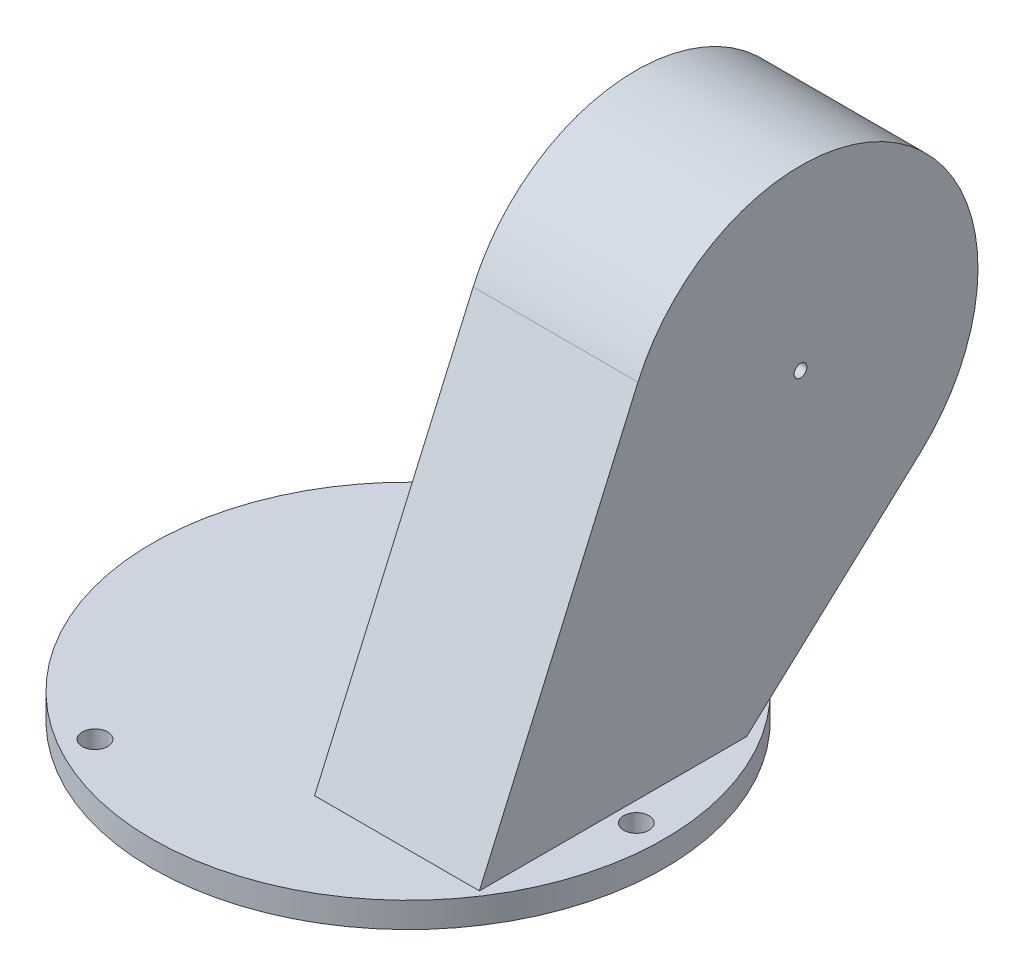
ISO-10303-21;
HEADER;
FILE_DESCRIPTION(('STEP AP214'),'2;1');
FILE_NAME('part.step','',(''),(''),'','','');
FILE_SCHEMA(('AUTOMOTIVE_DESIGN { 1 0 10303 214 1 1 1 1 }'));
ENDSEC;
DATA;
#1=APPLICATION_CONTEXT('core data for automotive mechanical design processes');
#2=APPLICATION_PROTOCOL_DEFINITION('international standard','automotive_design',2000,#1);
#3=PRODUCT_CONTEXT('',#1,'mechanical');
#4=PRODUCT('Part','Part','',(#3));
#5=PRODUCT_RELATED_PRODUCT_CATEGORY('part','',(#4));
#6=PRODUCT_DEFINITION_FORMATION('','',#4);
#7=PRODUCT_DEFINITION_CONTEXT('part definition',#1,'design');
#8=PRODUCT_DEFINITION('design','',#6,#7);
#9=PRODUCT_DEFINITION_SHAPE('','',#8);
#10=(LENGTH_UNIT() NAMED_UNIT(*) SI_UNIT(.MILLI.,.METRE.));
#11=(NAMED_UNIT(*) PLANE_ANGLE_UNIT() SI_UNIT($,.RADIAN.));
#12=(NAMED_UNIT(*) SI_UNIT($,.STERADIAN.) SOLID_ANGLE_UNIT());
#13=UNCERTAINTY_MEASURE_WITH_UNIT(LENGTH_MEASURE(1.E-05),#10,'distance_accuracy_value','');
#14=(GEOMETRIC_REPRESENTATION_CONTEXT(3) GLOBAL_UNCERTAINTY_ASSIGNED_CONTEXT((#13)) GLOBAL_UNIT_ASSIGNED_CONTEXT((#10,
#11,#12)) REPRESENTATION_CONTEXT('',''));
#15=CARTESIAN_POINT('',(0.,0.,0.));
#16=DIRECTION('',(0.,0.,1.));
#17=DIRECTION('',(1.,0.,0.));
#18=AXIS2_PLACEMENT_3D('',#15,#16,#17);
#19=CARTESIAN_POINT('',(0.,10.,0.));
#20=DIRECTION('',(0.,1.,0.));
#21=DIRECTION('',(0.,0.,1.));
#22=AXIS2_PLACEMENT_3D('',#19,#20,#21);
#23=PLANE('',#22);
#24=CARTESIAN_POINT('',(90.,10.,0.));
#25=DIRECTION('',(0.,1.,0.));
#26=DIRECTION('',(0.,0.,1.));
#27=AXIS2_PLACEMENT_3D('',#24,#25,#26);
#28=CIRCLE('',#27,5.);
#29=CARTESIAN_POINT('',(90.,10.,5.));
#30=VERTEX_POINT('',#29);
#31=EDGE_CURVE('E125',#30,#30,#28,.T.);
#32=ORIENTED_EDGE('',*,*,#31,.F.);
#33=EDGE_LOOP('',(#32));
#34=FACE_BOUND('',#33,.T.);
#35=DIRECTION('',(0.,0.,1.));
#36=VECTOR('',#35,1.);
#37=CARTESIAN_POINT('',(17.2389728615023,10.,-51.2500500903815));
#38=LINE('',#37,#36);
#39=CARTESIAN_POINT('',(17.2389728615023,10.,-51.2500500903815));
#40=VERTEX_POINT('',#39);
#41=CARTESIAN_POINT('',(17.2389728615023,10.,54.1281665274656));
#42=VERTEX_POINT('',#41);
#43=EDGE_CURVE('E89',#40,#42,#38,.T.);
#44=ORIENTED_EDGE('',*,*,#43,.F.);
#45=DIRECTION('',(1.,0.,0.));
#46=VECTOR('',#45,1.);
#47=CARTESIAN_POINT('',(17.2389728615023,10.,-51.2500500903815));
#48=LINE('',#47,#46);
#49=CARTESIAN_POINT('',(82.2389728615023,10.,-51.2500500903815));
#50=VERTEX_POINT('',#49);
#51=EDGE_CURVE('E95',#40,#50,#48,.T.);
#52=ORIENTED_EDGE('',*,*,#51,.T.);
#53=DIRECTION('',(0.,0.,1.));
#54=VECTOR('',#53,1.);
#55=CARTESIAN_POINT('',(82.2389728615023,10.,-51.2500500903815));
#56=LINE('',#55,#54);
#57=CARTESIAN_POINT('',(82.2389728615023,10.,54.1281665274656));
#58=VERTEX_POINT('',#57);
#59=EDGE_CURVE('E115',#50,#58,#56,.T.);
#60=ORIENTED_EDGE('',*,*,#59,.T.);
#61=DIRECTION('',(1.,0.,0.));
#62=VECTOR('',#61,1.);
#63=CARTESIAN_POINT('',(17.2389728615023,10.,54.1281665274656));
#64=LINE('',#63,#62);
#65=EDGE_CURVE('E101',#42,#58,#64,.T.);
#66=ORIENTED_EDGE('',*,*,#65,.F.);
#67=EDGE_LOOP('',(#44,#52,#60,#66));
#68=FACE_BOUND('',#67,.T.);
#69=CARTESIAN_POINT('',(-45.3316627358494,10.,-78.1337719104219));
#70=DIRECTION('',(0.,1.,0.));
#71=DIRECTION('',(0.866025403784436,0.,-0.500000000000004));
#72=AXIS2_PLACEMENT_3D('',#69,#70,#71);
#73=CIRCLE('',#72,5.);
#74=CARTESIAN_POINT('',(-41.0015357169272,10.,-80.6337719104219));
#75=VERTEX_POINT('',#74);
#76=EDGE_CURVE('E126',#75,#75,#73,.T.);
#77=ORIENTED_EDGE('',*,*,#76,.F.);
#78=EDGE_LOOP('',(#77));
#79=FACE_BOUND('',#78,.T.);
#80=CARTESIAN_POINT('',(-45.3316627358483,10.,78.1337719104225));
#81=DIRECTION('',(0.,1.,0.));
#82=DIRECTION('',(-0.866025403784443,0.,-0.499999999999992));
#83=AXIS2_PLACEMENT_3D('',#80,#81,#82);
#84=CIRCLE('',#83,5.);
#85=CARTESIAN_POINT('',(-49.6617897547706,10.,75.6337719104226));
#86=VERTEX_POINT('',#85);
#87=EDGE_CURVE('E121',#86,#86,#84,.T.);
#88=ORIENTED_EDGE('',*,*,#87,.F.);
#89=EDGE_LOOP('',(#88));
#90=FACE_BOUND('',#89,.T.);
#91=CARTESIAN_POINT('',(0.,10.,0.));
#92=DIRECTION('',(0.,1.,0.));
#93=DIRECTION('',(0.,0.,1.));
#94=AXIS2_PLACEMENT_3D('',#91,#92,#93);
#95=CIRCLE('',#94,101.);
#96=CARTESIAN_POINT('',(0.,10.,101.));
#97=VERTEX_POINT('',#96);
#98=EDGE_CURVE('E11',#97,#97,#95,.T.);
#99=ORIENTED_EDGE('',*,*,#98,.T.);
#100=EDGE_LOOP('',(#99));
#101=FACE_BOUND('',#100,.T.);
#102=ADVANCED_FACE('F41',(#34,#68,#79,#90,#101),#23,.T.);
#103=CARTESIAN_POINT('',(0.,10.,0.));
#104=DIRECTION('',(0.,-1.,0.));
#105=DIRECTION('',(0.,0.,-1.));
#106=AXIS2_PLACEMENT_3D('',#103,#104,#105);
#107=CYLINDRICAL_SURFACE('',#106,101.);
#108=ORIENTED_EDGE('',*,*,#98,.F.);
#109=EDGE_LOOP('',(#108));
#110=FACE_BOUND('',#109,.T.);
#111=CARTESIAN_POINT('',(0.,0.,0.));
#112=DIRECTION('',(0.,1.,0.));
#113=DIRECTION('',(0.,0.,1.));
#114=AXIS2_PLACEMENT_3D('',#111,#112,#113);
#115=CIRCLE('',#114,101.);
#116=CARTESIAN_POINT('',(0.,0.,101.));
#117=VERTEX_POINT('',#116);
#118=EDGE_CURVE('E45',#117,#117,#115,.T.);
#119=ORIENTED_EDGE('',*,*,#118,.T.);
#120=EDGE_LOOP('',(#119));
#121=FACE_BOUND('',#120,.T.);
#122=ADVANCED_FACE('F43',(#110,#121),#107,.T.);
#123=CARTESIAN_POINT('',(0.,0.,0.));
#124=DIRECTION('',(0.,1.,0.));
#125=DIRECTION('',(0.,0.,1.));
#126=AXIS2_PLACEMENT_3D('',#123,#124,#125);
#127=PLANE('',#126);
#128=CARTESIAN_POINT('',(-45.3316627358494,0.,-78.1337719104219));
#129=DIRECTION('',(0.,1.,0.));
#130=DIRECTION('',(0.866025403784436,0.,-0.500000000000004));
#131=AXIS2_PLACEMENT_3D('',#128,#129,#130);
#132=CIRCLE('',#131,5.);
#133=CARTESIAN_POINT('',(-41.0015357169272,0.,-80.6337719104219));
#134=VERTEX_POINT('',#133);
#135=EDGE_CURVE('E122',#134,#134,#132,.T.);
#136=ORIENTED_EDGE('',*,*,#135,.T.);
#137=EDGE_LOOP('',(#136));
#138=FACE_BOUND('',#137,.T.);
#139=CARTESIAN_POINT('',(-45.3316627358483,0.,78.1337719104225));
#140=DIRECTION('',(0.,1.,0.));
#141=DIRECTION('',(-0.866025403784443,0.,-0.499999999999992));
#142=AXIS2_PLACEMENT_3D('',#139,#140,#141);
#143=CIRCLE('',#142,5.);
#144=CARTESIAN_POINT('',(-49.6617897547706,0.,75.6337719104226));
#145=VERTEX_POINT('',#144);
#146=EDGE_CURVE('E129',#145,#145,#143,.T.);
#147=ORIENTED_EDGE('',*,*,#146,.T.);
#148=EDGE_LOOP('',(#147));
#149=FACE_BOUND('',#148,.T.);
#150=CARTESIAN_POINT('',(90.,0.,0.));
#151=DIRECTION('',(0.,1.,0.));
#152=DIRECTION('',(0.,0.,1.));
#153=AXIS2_PLACEMENT_3D('',#150,#151,#152);
#154=CIRCLE('',#153,5.);
#155=CARTESIAN_POINT('',(90.,0.,5.));
#156=VERTEX_POINT('',#155);
#157=EDGE_CURVE('E134',#156,#156,#154,.T.);
#158=ORIENTED_EDGE('',*,*,#157,.T.);
#159=EDGE_LOOP('',(#158));
#160=FACE_BOUND('',#159,.T.);
#161=ORIENTED_EDGE('',*,*,#118,.F.);
#162=EDGE_LOOP('',(#161));
#163=FACE_BOUND('',#162,.T.);
#164=ADVANCED_FACE('F148',(#138,#149,#160,#163),#127,.F.);
#165=CARTESIAN_POINT('',(90.,0.,0.));
#166=DIRECTION('',(0.,1.,0.));
#167=DIRECTION('',(0.,0.,1.));
#168=AXIS2_PLACEMENT_3D('',#165,#166,#167);
#169=CYLINDRICAL_SURFACE('',#168,5.);
#170=ORIENTED_EDGE('',*,*,#157,.F.);
#171=EDGE_LOOP('',(#170));
#172=FACE_BOUND('',#171,.T.);
#173=ORIENTED_EDGE('',*,*,#31,.T.);
#174=EDGE_LOOP('',(#173));
#175=FACE_BOUND('',#174,.T.);
#176=ADVANCED_FACE('F140',(#172,#175),#169,.F.);
#177=CARTESIAN_POINT('',(-45.3316627358483,0.,78.1337719104225));
#178=DIRECTION('',(0.,1.,0.));
#179=DIRECTION('',(0.,0.,1.));
#180=AXIS2_PLACEMENT_3D('',#177,#178,#179);
#181=CYLINDRICAL_SURFACE('',#180,5.);
#182=ORIENTED_EDGE('',*,*,#146,.F.);
#183=EDGE_LOOP('',(#182));
#184=FACE_BOUND('',#183,.T.);
#185=ORIENTED_EDGE('',*,*,#87,.T.);
#186=EDGE_LOOP('',(#185));
#187=FACE_BOUND('',#186,.T.);
#188=ADVANCED_FACE('F158',(#184,#187),#181,.F.);
#189=CARTESIAN_POINT('',(-45.3316627358494,0.,-78.1337719104219));
#190=DIRECTION('',(0.,1.,0.));
#191=DIRECTION('',(0.,0.,1.));
#192=AXIS2_PLACEMENT_3D('',#189,#190,#191);
#193=CYLINDRICAL_SURFACE('',#192,5.);
#194=ORIENTED_EDGE('',*,*,#135,.F.);
#195=EDGE_LOOP('',(#194));
#196=FACE_BOUND('',#195,.T.);
#197=ORIENTED_EDGE('',*,*,#76,.T.);
#198=EDGE_LOOP('',(#197));
#199=FACE_BOUND('',#198,.T.);
#200=ADVANCED_FACE('F172',(#196,#199),#193,.F.);
#201=CARTESIAN_POINT('',(17.2389728615023,124.345733942013,-72.51336012426));
#202=DIRECTION('',(1.,0.,0.));
#203=DIRECTION('',(0.,0.,-1.));
#204=AXIS2_PLACEMENT_3D('',#201,#202,#203);
#205=CYLINDRICAL_SURFACE('',#204,70.);
#206=CARTESIAN_POINT('',(82.2389728615023,124.345733942013,-72.51336012426));
#207=DIRECTION('',(-1.,0.,0.));
#208=DIRECTION('',(0.,0.,1.));
#209=AXIS2_PLACEMENT_3D('',#206,#207,#208);
#210=CIRCLE('',#209,70.);
#211=CARTESIAN_POINT('',(82.2389728615023,152.48203513511,-8.41695963896487));
#212=VERTEX_POINT('',#211);
#213=CARTESIAN_POINT('',(82.2389728615023,72.7053998247245,-119.770908645685));
#214=VERTEX_POINT('',#213);
#215=EDGE_CURVE('E110',#212,#214,#210,.T.);
#216=ORIENTED_EDGE('',*,*,#215,.T.);
#217=DIRECTION('',(1.,0.,0.));
#218=VECTOR('',#217,1.);
#219=CARTESIAN_POINT('',(17.2389728615023,72.7053998247245,-119.770908645685));
#220=LINE('',#219,#218);
#221=CARTESIAN_POINT('',(17.2389728615023,72.7053998247245,-119.770908645685));
#222=VERTEX_POINT('',#221);
#223=EDGE_CURVE('E100',#222,#214,#220,.T.);
#224=ORIENTED_EDGE('',*,*,#223,.F.);
#225=CARTESIAN_POINT('',(17.2389728615023,124.345733942013,-72.51336012426));
#226=DIRECTION('',(-1.,0.,0.));
#227=DIRECTION('',(0.,0.,1.));
#228=AXIS2_PLACEMENT_3D('',#225,#226,#227);
#229=CIRCLE('',#228,70.);
#230=CARTESIAN_POINT('',(17.2389728615023,152.48203513511,-8.41695963896487));
#231=VERTEX_POINT('',#230);
#232=EDGE_CURVE('E91',#231,#222,#229,.T.);
#233=ORIENTED_EDGE('',*,*,#232,.F.);
#234=DIRECTION('',(1.,0.,0.));
#235=VECTOR('',#234,1.);
#236=CARTESIAN_POINT('',(17.2389728615023,152.48203513511,-8.41695963896487));
#237=LINE('',#236,#235);
#238=EDGE_CURVE('E106',#231,#212,#237,.T.);
#239=ORIENTED_EDGE('',*,*,#238,.T.);
#240=EDGE_LOOP('',(#216,#224,#233,#239));
#241=FACE_BOUND('',#240,.T.);
#242=ADVANCED_FACE('F181',(#241),#205,.T.);
#243=CARTESIAN_POINT('',(17.2389728615023,72.7053998247245,-119.770908645685));
#244=DIRECTION('',(0.,0.737719058818406,0.675107836020354));
#245=DIRECTION('',(0.,-0.675107836020354,0.737719058818406));
#246=AXIS2_PLACEMENT_3D('',#243,#244,#245);
#247=PLANE('',#246);
#248=DIRECTION('',(0.,-0.675107836020354,0.737719058818406));
#249=VECTOR('',#248,1.);
#250=CARTESIAN_POINT('',(82.2389728615023,72.7053998247245,-119.770908645685));
#251=LINE('',#250,#249);
#252=EDGE_CURVE('E97',#214,#50,#251,.T.);
#253=ORIENTED_EDGE('',*,*,#252,.T.);
#254=ORIENTED_EDGE('',*,*,#51,.F.);
#255=DIRECTION('',(0.,-0.675107836020354,0.737719058818406));
#256=VECTOR('',#255,1.);
#257=CARTESIAN_POINT('',(17.2389728615023,72.7053998247245,-119.770908645685));
#258=LINE('',#257,#256);
#259=EDGE_CURVE('E86',#222,#40,#258,.T.);
#260=ORIENTED_EDGE('',*,*,#259,.F.);
#261=ORIENTED_EDGE('',*,*,#223,.T.);
#262=EDGE_LOOP('',(#253,#254,#260,#261));
#263=FACE_BOUND('',#262,.T.);
#264=ADVANCED_FACE('F96',(#263),#247,.F.);
#265=CARTESIAN_POINT('',(17.2389728615023,152.48203513511,-8.41695963896487));
#266=DIRECTION('',(0.,-0.401947159901382,-0.915662864075645));
#267=DIRECTION('',(0.,0.915662864075645,-0.401947159901382));
#268=AXIS2_PLACEMENT_3D('',#265,#266,#267);
#269=PLANE('',#268);
#270=DIRECTION('',(0.,0.915662864075645,-0.401947159901382));
#271=VECTOR('',#270,1.);
#272=CARTESIAN_POINT('',(82.2389728615023,152.48203513511,-8.41695963896487));
#273=LINE('',#272,#271);
#274=EDGE_CURVE('E56',#58,#212,#273,.T.);
#275=ORIENTED_EDGE('',*,*,#274,.T.);
#276=ORIENTED_EDGE('',*,*,#238,.F.);
#277=DIRECTION('',(0.,0.915662864075645,-0.401947159901382));
#278=VECTOR('',#277,1.);
#279=CARTESIAN_POINT('',(17.2389728615023,152.48203513511,-8.41695963896487));
#280=LINE('',#279,#278);
#281=EDGE_CURVE('E65',#42,#231,#280,.T.);
#282=ORIENTED_EDGE('',*,*,#281,.F.);
#283=ORIENTED_EDGE('',*,*,#65,.T.);
#284=EDGE_LOOP('',(#275,#276,#282,#283));
#285=FACE_BOUND('',#284,.T.);
#286=ADVANCED_FACE('F190',(#285),#269,.F.);
#287=CARTESIAN_POINT('',(17.2389728615023,124.345733942013,-72.51336012426));
#288=DIRECTION('',(-1.,0.,0.));
#289=DIRECTION('',(0.,0.,1.));
#290=AXIS2_PLACEMENT_3D('',#287,#288,#289);
#291=PLANE('',#290);
#292=CARTESIAN_POINT('',(17.2389728615023,124.345733942013,-72.51336012426));
#293=DIRECTION('',(-1.,0.,0.));
#294=DIRECTION('',(0.,0.,1.));
#295=AXIS2_PLACEMENT_3D('',#292,#293,#294);
#296=CIRCLE('',#295,15.);
#297=CARTESIAN_POINT('',(17.2389728615023,124.345733942013,-57.51336012426));
#298=VERTEX_POINT('',#297);
#299=EDGE_CURVE('E219',#298,#298,#296,.T.);
#300=ORIENTED_EDGE('',*,*,#299,.F.);
#301=EDGE_LOOP('',(#300));
#302=FACE_BOUND('',#301,.T.);
#303=ORIENTED_EDGE('',*,*,#232,.T.);
#304=ORIENTED_EDGE('',*,*,#259,.T.);
#305=ORIENTED_EDGE('',*,*,#43,.T.);
#306=ORIENTED_EDGE('',*,*,#281,.T.);
#307=EDGE_LOOP('',(#303,#304,#305,#306));
#308=FACE_BOUND('',#307,.T.);
#309=ADVANCED_FACE('F87',(#302,#308),#291,.T.);
#310=CARTESIAN_POINT('',(82.2389728615023,124.345733942013,-72.51336012426));
#311=DIRECTION('',(-1.,0.,0.));
#312=DIRECTION('',(0.,0.,1.));
#313=AXIS2_PLACEMENT_3D('',#310,#311,#312);
#314=PLANE('',#313);
#315=CARTESIAN_POINT('',(82.2389728615023,124.345733942013,-72.51336012426));
#316=DIRECTION('',(-1.,0.,0.));
#317=DIRECTION('',(0.,0.,1.));
#318=AXIS2_PLACEMENT_3D('',#315,#316,#317);
#319=CIRCLE('',#318,2.5);
#320=CARTESIAN_POINT('',(82.2389728615023,124.345733942013,-70.01336012426));
#321=VERTEX_POINT('',#320);
#322=EDGE_CURVE('E113',#321,#321,#319,.F.);
#323=ORIENTED_EDGE('',*,*,#322,.F.);
#324=EDGE_LOOP('',(#323));
#325=FACE_BOUND('',#324,.T.);
#326=ORIENTED_EDGE('',*,*,#215,.F.);
#327=ORIENTED_EDGE('',*,*,#274,.F.);
#328=ORIENTED_EDGE('',*,*,#59,.F.);
#329=ORIENTED_EDGE('',*,*,#252,.F.);
#330=EDGE_LOOP('',(#326,#327,#328,#329));
#331=FACE_BOUND('',#330,.T.);
#332=ADVANCED_FACE('F193',(#325,#331),#314,.F.);
#333=CARTESIAN_POINT('',(101.001,124.345733942013,-72.51336012426));
#334=DIRECTION('',(-1.,0.,0.));
#335=DIRECTION('',(0.,0.,1.));
#336=AXIS2_PLACEMENT_3D('',#333,#334,#335);
#337=CYLINDRICAL_SURFACE('',#336,2.5);
#338=ORIENTED_EDGE('',*,*,#322,.T.);
#339=EDGE_LOOP('',(#338));
#340=FACE_BOUND('',#339,.T.);
#341=CARTESIAN_POINT('',(14.2389728615023,124.345733942013,-72.51336012426));
#342=DIRECTION('',(-1.,0.,0.));
#343=DIRECTION('',(0.,0.,1.));
#344=AXIS2_PLACEMENT_3D('',#341,#342,#343);
#345=CIRCLE('',#344,2.5);
#346=CARTESIAN_POINT('',(14.2389728615023,124.345733942013,-70.01336012426));
#347=VERTEX_POINT('',#346);
#348=EDGE_CURVE('E215',#347,#347,#345,.T.);
#349=ORIENTED_EDGE('',*,*,#348,.T.);
#350=EDGE_LOOP('',(#349));
#351=FACE_BOUND('',#350,.T.);
#352=ADVANCED_FACE('F196',(#340,#351),#337,.F.);
#353=CARTESIAN_POINT('',(14.2389728615023,124.345733942013,-72.51336012426));
#354=DIRECTION('',(1.,0.,0.));
#355=DIRECTION('',(0.,0.,-1.));
#356=AXIS2_PLACEMENT_3D('',#353,#354,#355);
#357=CYLINDRICAL_SURFACE('',#356,15.);
#358=CARTESIAN_POINT('',(14.2389728615023,124.345733942013,-72.51336012426));
#359=DIRECTION('',(-1.,0.,0.));
#360=DIRECTION('',(0.,0.,1.));
#361=AXIS2_PLACEMENT_3D('',#358,#359,#360);
#362=CIRCLE('',#361,15.);
#363=CARTESIAN_POINT('',(14.2389728615023,124.345733942013,-57.51336012426));
#364=VERTEX_POINT('',#363);
#365=EDGE_CURVE('E218',#364,#364,#362,.T.);
#366=ORIENTED_EDGE('',*,*,#365,.F.);
#367=EDGE_LOOP('',(#366));
#368=FACE_BOUND('',#367,.T.);
#369=ORIENTED_EDGE('',*,*,#299,.T.);
#370=EDGE_LOOP('',(#369));
#371=FACE_BOUND('',#370,.T.);
#372=ADVANCED_FACE('F203',(#368,#371),#357,.T.);
#373=CARTESIAN_POINT('',(14.2389728615023,124.345733942013,-72.51336012426));
#374=DIRECTION('',(-1.,0.,0.));
#375=DIRECTION('',(0.,0.,1.));
#376=AXIS2_PLACEMENT_3D('',#373,#374,#375);
#377=PLANE('',#376);
#378=ORIENTED_EDGE('',*,*,#348,.F.);
#379=EDGE_LOOP('',(#378));
#380=FACE_BOUND('',#379,.T.);
#381=ORIENTED_EDGE('',*,*,#365,.T.);
#382=EDGE_LOOP('',(#381));
#383=FACE_BOUND('',#382,.T.);
#384=ADVANCED_FACE('F207',(#380,#383),#377,.T.);
#385=CLOSED_SHELL('',(#102,#122,#164,#176,#188,#200,#242,#264,#286,#309,#332,#352,#372,#384));
#386=MANIFOLD_SOLID_BREP('B2',#385);
#387=ADVANCED_BREP_SHAPE_REPRESENTATION('',(#18,#386),#14);
#388=SHAPE_DEFINITION_REPRESENTATION(#9,#387);
ENDSEC;
END-ISO-10303-21;
